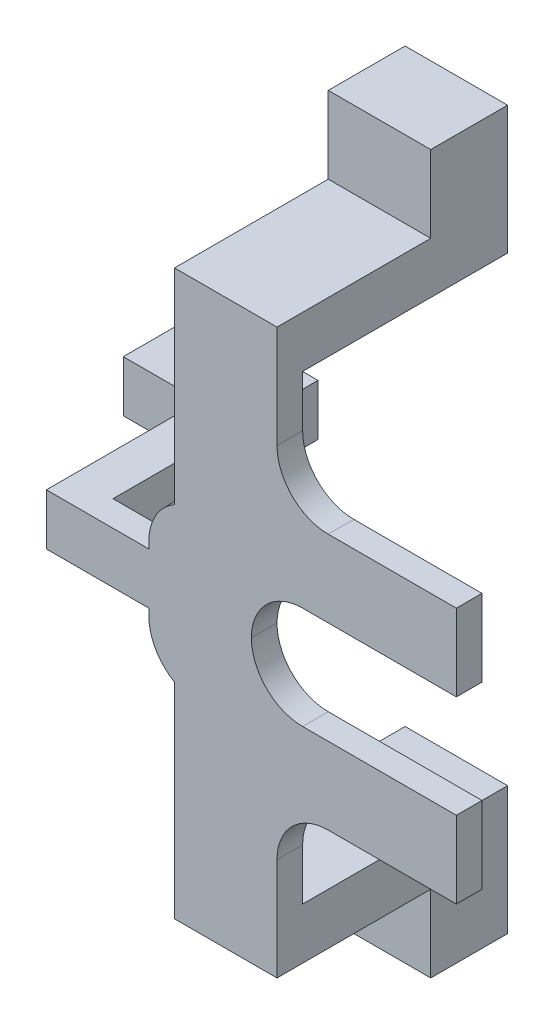
ISO-10303-21;
HEADER;
FILE_DESCRIPTION(('STEP AP214'),'2;1');
FILE_NAME('part.step','',(''),(''),'','','');
FILE_SCHEMA(('AUTOMOTIVE_DESIGN { 1 0 10303 214 1 1 1 1 }'));
ENDSEC;
DATA;
#1=APPLICATION_CONTEXT('core data for automotive mechanical design processes');
#2=APPLICATION_PROTOCOL_DEFINITION('international standard','automotive_design',2000,#1);
#3=PRODUCT_CONTEXT('',#1,'mechanical');
#4=PRODUCT('Part','Part','',(#3));
#5=PRODUCT_RELATED_PRODUCT_CATEGORY('part','',(#4));
#6=PRODUCT_DEFINITION_FORMATION('','',#4);
#7=PRODUCT_DEFINITION_CONTEXT('part definition',#1,'design');
#8=PRODUCT_DEFINITION('design','',#6,#7);
#9=PRODUCT_DEFINITION_SHAPE('','',#8);
#10=(LENGTH_UNIT() NAMED_UNIT(*) SI_UNIT(.MILLI.,.METRE.));
#11=(NAMED_UNIT(*) PLANE_ANGLE_UNIT() SI_UNIT($,.RADIAN.));
#12=(NAMED_UNIT(*) SI_UNIT($,.STERADIAN.) SOLID_ANGLE_UNIT());
#13=UNCERTAINTY_MEASURE_WITH_UNIT(LENGTH_MEASURE(1.E-05),#10,'distance_accuracy_value','');
#14=(GEOMETRIC_REPRESENTATION_CONTEXT(3) GLOBAL_UNCERTAINTY_ASSIGNED_CONTEXT((#13)) GLOBAL_UNIT_ASSIGNED_CONTEXT((#10,
#11,#12)) REPRESENTATION_CONTEXT('',''));
#15=CARTESIAN_POINT('',(0.,0.,0.));
#16=DIRECTION('',(0.,0.,1.));
#17=DIRECTION('',(1.,0.,0.));
#18=AXIS2_PLACEMENT_3D('',#15,#16,#17);
#19=CARTESIAN_POINT('',(-5.,-15.,5.));
#20=DIRECTION('',(1.,0.,0.));
#21=DIRECTION('',(0.,1.,0.));
#22=AXIS2_PLACEMENT_3D('',#19,#20,#21);
#23=PLANE('',#22);
#24=DIRECTION('',(0.,-1.,0.));
#25=VECTOR('',#24,1.);
#26=CARTESIAN_POINT('',(-5.,-15.,0.));
#27=LINE('',#26,#25);
#28=CARTESIAN_POINT('',(-5.,-35.,0.));
#29=VERTEX_POINT('',#28);
#30=CARTESIAN_POINT('',(-5.,-45.,0.));
#31=VERTEX_POINT('',#30);
#32=EDGE_CURVE('E459',#29,#31,#27,.T.);
#33=ORIENTED_EDGE('',*,*,#32,.F.);
#34=DIRECTION('',(0.,0.,1.));
#35=VECTOR('',#34,1.);
#36=CARTESIAN_POINT('',(-5.,-35.,5.));
#37=LINE('',#36,#35);
#38=CARTESIAN_POINT('',(-5.,-35.,5.));
#39=VERTEX_POINT('',#38);
#40=EDGE_CURVE('E510',#29,#39,#37,.T.);
#41=ORIENTED_EDGE('',*,*,#40,.T.);
#42=DIRECTION('',(0.,-1.,0.));
#43=VECTOR('',#42,1.);
#44=CARTESIAN_POINT('',(-5.,-15.,5.));
#45=LINE('',#44,#43);
#46=CARTESIAN_POINT('',(-5.,-55.,5.));
#47=VERTEX_POINT('',#46);
#48=EDGE_CURVE('E458',#39,#47,#45,.T.);
#49=ORIENTED_EDGE('',*,*,#48,.T.);
#50=DIRECTION('',(0.,0.,-1.));
#51=VECTOR('',#50,1.);
#52=CARTESIAN_POINT('',(-5.,-55.,5.));
#53=LINE('',#52,#51);
#54=CARTESIAN_POINT('',(-5.,-55.,-25.));
#55=VERTEX_POINT('',#54);
#56=EDGE_CURVE('E471',#47,#55,#53,.T.);
#57=ORIENTED_EDGE('',*,*,#56,.T.);
#58=DIRECTION('',(0.,-1.,0.));
#59=VECTOR('',#58,1.);
#60=CARTESIAN_POINT('',(-5.,-55.,-25.));
#61=LINE('',#60,#59);
#62=CARTESIAN_POINT('',(-5.,-70.,-25.));
#63=VERTEX_POINT('',#62);
#64=EDGE_CURVE('E348',#55,#63,#61,.T.);
#65=ORIENTED_EDGE('',*,*,#64,.T.);
#66=DIRECTION('',(0.,0.,-1.));
#67=VECTOR('',#66,1.);
#68=CARTESIAN_POINT('',(-5.,-70.,-25.));
#69=LINE('',#68,#67);
#70=CARTESIAN_POINT('',(-5.,-70.,-40.));
#71=VERTEX_POINT('',#70);
#72=EDGE_CURVE('E354',#63,#71,#69,.T.);
#73=ORIENTED_EDGE('',*,*,#72,.T.);
#74=DIRECTION('',(0.,-1.,0.));
#75=VECTOR('',#74,1.);
#76=CARTESIAN_POINT('',(-5.,-55.,-40.));
#77=LINE('',#76,#75);
#78=CARTESIAN_POINT('',(-5.,-45.,-40.));
#79=VERTEX_POINT('',#78);
#80=EDGE_CURVE('E404',#79,#71,#77,.T.);
#81=ORIENTED_EDGE('',*,*,#80,.F.);
#82=DIRECTION('',(0.,0.,1.));
#83=VECTOR('',#82,1.);
#84=CARTESIAN_POINT('',(-5.,-45.,-40.));
#85=LINE('',#84,#83);
#86=EDGE_CURVE('E406',#79,#31,#85,.T.);
#87=ORIENTED_EDGE('',*,*,#86,.T.);
#88=EDGE_LOOP('',(#33,#41,#49,#57,#65,#73,#81,#87));
#89=FACE_BOUND('',#88,.T.);
#90=ADVANCED_FACE('F36',(#89),#23,.T.);
#91=CARTESIAN_POINT('',(30.,0.,5.));
#92=DIRECTION('',(-1.,0.,0.));
#93=DIRECTION('',(0.,0.,1.));
#94=AXIS2_PLACEMENT_3D('',#91,#92,#93);
#95=PLANE('',#94);
#96=DIRECTION('',(0.,1.,0.));
#97=VECTOR('',#96,1.);
#98=CARTESIAN_POINT('',(30.,0.,5.));
#99=LINE('',#98,#97);
#100=CARTESIAN_POINT('',(30.,10.,5.));
#101=VERTEX_POINT('',#100);
#102=CARTESIAN_POINT('',(30.,25.,5.));
#103=VERTEX_POINT('',#102);
#104=EDGE_CURVE('E501',#101,#103,#99,.T.);
#105=ORIENTED_EDGE('',*,*,#104,.F.);
#106=DIRECTION('',(0.,0.,1.));
#107=VECTOR('',#106,1.);
#108=CARTESIAN_POINT('',(30.,10.,0.));
#109=LINE('',#108,#107);
#110=CARTESIAN_POINT('',(30.,10.,0.));
#111=VERTEX_POINT('',#110);
#112=EDGE_CURVE('E317',#111,#101,#109,.T.);
#113=ORIENTED_EDGE('',*,*,#112,.F.);
#114=DIRECTION('',(0.,1.,0.));
#115=VECTOR('',#114,1.);
#116=CARTESIAN_POINT('',(30.,0.,0.));
#117=LINE('',#116,#115);
#118=CARTESIAN_POINT('',(30.,25.,0.));
#119=VERTEX_POINT('',#118);
#120=EDGE_CURVE('E279',#111,#119,#117,.T.);
#121=ORIENTED_EDGE('',*,*,#120,.T.);
#122=DIRECTION('',(0.,0.,1.));
#123=VECTOR('',#122,1.);
#124=CARTESIAN_POINT('',(30.,25.,0.));
#125=LINE('',#124,#123);
#126=EDGE_CURVE('E302',#119,#103,#125,.T.);
#127=ORIENTED_EDGE('',*,*,#126,.T.);
#128=EDGE_LOOP('',(#105,#113,#121,#127));
#129=FACE_BOUND('',#128,.T.);
#130=ADVANCED_FACE('F592',(#129),#95,.F.);
#131=CARTESIAN_POINT('',(-50.,-5.,5.));
#132=DIRECTION('',(-1.,0.,0.));
#133=DIRECTION('',(0.,0.,1.));
#134=AXIS2_PLACEMENT_3D('',#131,#132,#133);
#135=PLANE('',#134);
#136=DIRECTION('',(0.,0.,-1.));
#137=VECTOR('',#136,1.);
#138=CARTESIAN_POINT('',(-50.,5.,5.));
#139=LINE('',#138,#137);
#140=CARTESIAN_POINT('',(-50.,5.,5.));
#141=VERTEX_POINT('',#140);
#142=CARTESIAN_POINT('',(-50.,5.,-25.));
#143=VERTEX_POINT('',#142);
#144=EDGE_CURVE('E447',#141,#143,#139,.T.);
#145=ORIENTED_EDGE('',*,*,#144,.T.);
#146=DIRECTION('',(0.,-1.,0.));
#147=VECTOR('',#146,1.);
#148=CARTESIAN_POINT('',(-50.,5.,-25.));
#149=LINE('',#148,#147);
#150=CARTESIAN_POINT('',(-50.,-5.,-25.));
#151=VERTEX_POINT('',#150);
#152=EDGE_CURVE('E324',#143,#151,#149,.T.);
#153=ORIENTED_EDGE('',*,*,#152,.T.);
#154=DIRECTION('',(0.,0.,-1.));
#155=VECTOR('',#154,1.);
#156=CARTESIAN_POINT('',(-50.,-5.,5.));
#157=LINE('',#156,#155);
#158=CARTESIAN_POINT('',(-50.,-5.,5.));
#159=VERTEX_POINT('',#158);
#160=EDGE_CURVE('E450',#159,#151,#157,.T.);
#161=ORIENTED_EDGE('',*,*,#160,.F.);
#162=DIRECTION('',(0.,1.,0.));
#163=VECTOR('',#162,1.);
#164=CARTESIAN_POINT('',(-50.,-5.,5.));
#165=LINE('',#164,#163);
#166=EDGE_CURVE('E434',#159,#141,#165,.T.);
#167=ORIENTED_EDGE('',*,*,#166,.T.);
#168=EDGE_LOOP('',(#145,#153,#161,#167));
#169=FACE_BOUND('',#168,.T.);
#170=ADVANCED_FACE('F597',(#169),#135,.T.);
#171=CARTESIAN_POINT('',(-5.,-55.,5.));
#172=DIRECTION('',(0.,-1.,0.));
#173=DIRECTION('',(0.,0.,-1.));
#174=AXIS2_PLACEMENT_3D('',#171,#172,#173);
#175=PLANE('',#174);
#176=DIRECTION('',(0.,0.,-1.));
#177=VECTOR('',#176,1.);
#178=CARTESIAN_POINT('',(-25.,-55.,5.));
#179=LINE('',#178,#177);
#180=CARTESIAN_POINT('',(-25.,-55.,5.));
#181=VERTEX_POINT('',#180);
#182=CARTESIAN_POINT('',(-25.,-55.,-25.));
#183=VERTEX_POINT('',#182);
#184=EDGE_CURVE('E467',#181,#183,#179,.T.);
#185=ORIENTED_EDGE('',*,*,#184,.T.);
#186=DIRECTION('',(1.,0.,0.));
#187=VECTOR('',#186,1.);
#188=CARTESIAN_POINT('',(-25.,-55.,-25.));
#189=LINE('',#188,#187);
#190=EDGE_CURVE('E345',#183,#55,#189,.T.);
#191=ORIENTED_EDGE('',*,*,#190,.T.);
#192=ORIENTED_EDGE('',*,*,#56,.F.);
#193=DIRECTION('',(-1.,0.,0.));
#194=VECTOR('',#193,1.);
#195=CARTESIAN_POINT('',(-5.,-55.,5.));
#196=LINE('',#195,#194);
#197=EDGE_CURVE('E461',#47,#181,#196,.T.);
#198=ORIENTED_EDGE('',*,*,#197,.T.);
#199=EDGE_LOOP('',(#185,#191,#192,#198));
#200=FACE_BOUND('',#199,.T.);
#201=ADVANCED_FACE('F569',(#200),#175,.T.);
#202=CARTESIAN_POINT('',(-5.,55.,5.));
#203=DIRECTION('',(0.,1.,0.));
#204=DIRECTION('',(0.,0.,1.));
#205=AXIS2_PLACEMENT_3D('',#202,#203,#204);
#206=PLANE('',#205);
#207=DIRECTION('',(0.,0.,-1.));
#208=VECTOR('',#207,1.);
#209=CARTESIAN_POINT('',(-5.,55.,5.));
#210=LINE('',#209,#208);
#211=CARTESIAN_POINT('',(-5.,55.,5.));
#212=VERTEX_POINT('',#211);
#213=CARTESIAN_POINT('',(-5.,55.,-25.));
#214=VERTEX_POINT('',#213);
#215=EDGE_CURVE('E490',#212,#214,#210,.T.);
#216=ORIENTED_EDGE('',*,*,#215,.T.);
#217=DIRECTION('',(-1.,0.,0.));
#218=VECTOR('',#217,1.);
#219=CARTESIAN_POINT('',(-25.,55.,-25.));
#220=LINE('',#219,#218);
#221=CARTESIAN_POINT('',(-25.,55.,-25.));
#222=VERTEX_POINT('',#221);
#223=EDGE_CURVE('E363',#214,#222,#220,.T.);
#224=ORIENTED_EDGE('',*,*,#223,.T.);
#225=DIRECTION('',(0.,0.,-1.));
#226=VECTOR('',#225,1.);
#227=CARTESIAN_POINT('',(-25.,55.,5.));
#228=LINE('',#227,#226);
#229=CARTESIAN_POINT('',(-25.,55.,5.));
#230=VERTEX_POINT('',#229);
#231=EDGE_CURVE('E494',#230,#222,#228,.T.);
#232=ORIENTED_EDGE('',*,*,#231,.F.);
#233=DIRECTION('',(1.,0.,0.));
#234=VECTOR('',#233,1.);
#235=CARTESIAN_POINT('',(-5.,55.,5.));
#236=LINE('',#235,#234);
#237=EDGE_CURVE('E479',#230,#212,#236,.T.);
#238=ORIENTED_EDGE('',*,*,#237,.T.);
#239=EDGE_LOOP('',(#216,#224,#232,#238));
#240=FACE_BOUND('',#239,.T.);
#241=ADVANCED_FACE('F611',(#240),#206,.T.);
#242=CARTESIAN_POINT('',(0.,0.,0.));
#243=DIRECTION('',(0.,0.,1.));
#244=DIRECTION('',(1.,0.,0.));
#245=AXIS2_PLACEMENT_3D('',#242,#243,#244);
#246=PLANE('',#245);
#247=DIRECTION('',(0.,1.,0.));
#248=VECTOR('',#247,1.);
#249=CARTESIAN_POINT('',(-25.,-55.,0.));
#250=LINE('',#249,#248);
#251=CARTESIAN_POINT('',(-25.,-45.,0.));
#252=VERTEX_POINT('',#251);
#253=CARTESIAN_POINT('',(-25.,-15.,0.));
#254=VERTEX_POINT('',#253);
#255=EDGE_CURVE('E446',#252,#254,#250,.T.);
#256=ORIENTED_EDGE('',*,*,#255,.T.);
#257=CARTESIAN_POINT('',(-20.,-6.33974596215562,0.));
#258=DIRECTION('',(0.,0.,1.));
#259=DIRECTION('',(1.,0.,0.));
#260=AXIS2_PLACEMENT_3D('',#257,#258,#259);
#261=CIRCLE('',#260,10.);
#262=CARTESIAN_POINT('',(-30.,-6.33974596215562,0.));
#263=VERTEX_POINT('',#262);
#264=EDGE_CURVE('E539',#254,#263,#261,.F.);
#265=ORIENTED_EDGE('',*,*,#264,.T.);
#266=DIRECTION('',(0.,1.,0.));
#267=VECTOR('',#266,1.);
#268=CARTESIAN_POINT('',(-30.,0.,0.));
#269=LINE('',#268,#267);
#270=CARTESIAN_POINT('',(-30.,-5.,0.));
#271=VERTEX_POINT('',#270);
#272=EDGE_CURVE('E504',#263,#271,#269,.T.);
#273=ORIENTED_EDGE('',*,*,#272,.T.);
#274=DIRECTION('',(-1.,0.,0.));
#275=VECTOR('',#274,1.);
#276=CARTESIAN_POINT('',(-50.,-5.,0.));
#277=LINE('',#276,#275);
#278=CARTESIAN_POINT('',(-42.,-5.,0.));
#279=VERTEX_POINT('',#278);
#280=EDGE_CURVE('E430',#271,#279,#277,.T.);
#281=ORIENTED_EDGE('',*,*,#280,.T.);
#282=DIRECTION('',(0.,-1.,0.));
#283=VECTOR('',#282,1.);
#284=CARTESIAN_POINT('',(-42.,-5.,0.));
#285=LINE('',#284,#283);
#286=CARTESIAN_POINT('',(-42.,5.,0.));
#287=VERTEX_POINT('',#286);
#288=EDGE_CURVE('E381',#287,#279,#285,.T.);
#289=ORIENTED_EDGE('',*,*,#288,.F.);
#290=DIRECTION('',(1.,0.,0.));
#291=VECTOR('',#290,1.);
#292=CARTESIAN_POINT('',(-50.,5.,0.));
#293=LINE('',#292,#291);
#294=CARTESIAN_POINT('',(-30.,5.,0.));
#295=VERTEX_POINT('',#294);
#296=EDGE_CURVE('E435',#287,#295,#293,.T.);
#297=ORIENTED_EDGE('',*,*,#296,.T.);
#298=CARTESIAN_POINT('',(-30.,6.33974596215561,0.));
#299=VERTEX_POINT('',#298);
#300=EDGE_CURVE('E493',#295,#299,#269,.T.);
#301=ORIENTED_EDGE('',*,*,#300,.T.);
#302=CARTESIAN_POINT('',(-20.,6.33974596215561,0.));
#303=DIRECTION('',(0.,0.,1.));
#304=DIRECTION('',(1.,0.,0.));
#305=AXIS2_PLACEMENT_3D('',#302,#303,#304);
#306=CIRCLE('',#305,10.);
#307=CARTESIAN_POINT('',(-25.,15.,0.));
#308=VERTEX_POINT('',#307);
#309=EDGE_CURVE('E535',#299,#308,#306,.F.);
#310=ORIENTED_EDGE('',*,*,#309,.T.);
#311=DIRECTION('',(0.,1.,0.));
#312=VECTOR('',#311,1.);
#313=CARTESIAN_POINT('',(-25.,55.,0.));
#314=LINE('',#313,#312);
#315=CARTESIAN_POINT('',(-25.,45.,0.));
#316=VERTEX_POINT('',#315);
#317=EDGE_CURVE('E470',#308,#316,#314,.T.);
#318=ORIENTED_EDGE('',*,*,#317,.T.);
#319=DIRECTION('',(-1.,0.,0.));
#320=VECTOR('',#319,1.);
#321=CARTESIAN_POINT('',(-5.,45.,0.));
#322=LINE('',#321,#320);
#323=CARTESIAN_POINT('',(-5.,45.,0.));
#324=VERTEX_POINT('',#323);
#325=EDGE_CURVE('E414',#324,#316,#322,.T.);
#326=ORIENTED_EDGE('',*,*,#325,.F.);
#327=DIRECTION('',(0.,-1.,0.));
#328=VECTOR('',#327,1.);
#329=CARTESIAN_POINT('',(-5.,15.,0.));
#330=LINE('',#329,#328);
#331=CARTESIAN_POINT('',(-5.,35.,0.));
#332=VERTEX_POINT('',#331);
#333=EDGE_CURVE('E480',#324,#332,#330,.T.);
#334=ORIENTED_EDGE('',*,*,#333,.T.);
#335=CARTESIAN_POINT('',(5.,35.,0.));
#336=DIRECTION('',(0.,0.,1.));
#337=DIRECTION('',(1.,0.,0.));
#338=AXIS2_PLACEMENT_3D('',#335,#336,#337);
#339=CIRCLE('',#338,10.);
#340=CARTESIAN_POINT('',(5.,25.,0.));
#341=VERTEX_POINT('',#340);
#342=EDGE_CURVE('E533',#332,#341,#339,.T.);
#343=ORIENTED_EDGE('',*,*,#342,.T.);
#344=DIRECTION('',(-1.,0.,0.));
#345=VECTOR('',#344,1.);
#346=CARTESIAN_POINT('',(0.,25.,0.));
#347=LINE('',#346,#345);
#348=EDGE_CURVE('E299',#119,#341,#347,.T.);
#349=ORIENTED_EDGE('',*,*,#348,.F.);
#350=ORIENTED_EDGE('',*,*,#120,.F.);
#351=DIRECTION('',(-1.,0.,0.));
#352=VECTOR('',#351,1.);
#353=CARTESIAN_POINT('',(-10.,10.,0.));
#354=LINE('',#353,#352);
#355=CARTESIAN_POINT('',(0.,10.,0.));
#356=VERTEX_POINT('',#355);
#357=EDGE_CURVE('E309',#111,#356,#354,.T.);
#358=ORIENTED_EDGE('',*,*,#357,.T.);
#359=CARTESIAN_POINT('',(0.,0.,0.));
#360=DIRECTION('',(0.,0.,1.));
#361=DIRECTION('',(1.,0.,0.));
#362=AXIS2_PLACEMENT_3D('',#359,#360,#361);
#363=CIRCLE('',#362,10.);
#364=CARTESIAN_POINT('',(-10.,0.,0.));
#365=VERTEX_POINT('',#364);
#366=EDGE_CURVE('E525',#356,#365,#363,.T.);
#367=ORIENTED_EDGE('',*,*,#366,.T.);
#368=CARTESIAN_POINT('',(0.,0.,0.));
#369=DIRECTION('',(0.,0.,1.));
#370=DIRECTION('',(1.,0.,0.));
#371=AXIS2_PLACEMENT_3D('',#368,#369,#370);
#372=CIRCLE('',#371,10.);
#373=CARTESIAN_POINT('',(0.,-10.,0.));
#374=VERTEX_POINT('',#373);
#375=EDGE_CURVE('E521',#365,#374,#372,.T.);
#376=ORIENTED_EDGE('',*,*,#375,.T.);
#377=DIRECTION('',(1.,0.,0.));
#378=VECTOR('',#377,1.);
#379=CARTESIAN_POINT('',(-10.,-10.,0.));
#380=LINE('',#379,#378);
#381=CARTESIAN_POINT('',(30.,-10.,0.));
#382=VERTEX_POINT('',#381);
#383=EDGE_CURVE('E274',#374,#382,#380,.T.);
#384=ORIENTED_EDGE('',*,*,#383,.T.);
#385=CARTESIAN_POINT('',(30.,-25.,0.));
#386=VERTEX_POINT('',#385);
#387=EDGE_CURVE('E266',#386,#382,#117,.T.);
#388=ORIENTED_EDGE('',*,*,#387,.F.);
#389=DIRECTION('',(-1.,0.,0.));
#390=VECTOR('',#389,1.);
#391=CARTESIAN_POINT('',(0.,-25.,0.));
#392=LINE('',#391,#390);
#393=CARTESIAN_POINT('',(5.,-25.,0.));
#394=VERTEX_POINT('',#393);
#395=EDGE_CURVE('E271',#386,#394,#392,.T.);
#396=ORIENTED_EDGE('',*,*,#395,.T.);
#397=CARTESIAN_POINT('',(5.,-35.,0.));
#398=DIRECTION('',(0.,0.,1.));
#399=DIRECTION('',(1.,0.,0.));
#400=AXIS2_PLACEMENT_3D('',#397,#398,#399);
#401=CIRCLE('',#400,10.);
#402=EDGE_CURVE('E529',#394,#29,#401,.T.);
#403=ORIENTED_EDGE('',*,*,#402,.T.);
#404=ORIENTED_EDGE('',*,*,#32,.T.);
#405=DIRECTION('',(1.,0.,0.));
#406=VECTOR('',#405,1.);
#407=CARTESIAN_POINT('',(-5.,-45.,0.));
#408=LINE('',#407,#406);
#409=EDGE_CURVE('E399',#252,#31,#408,.T.);
#410=ORIENTED_EDGE('',*,*,#409,.F.);
#411=EDGE_LOOP('',(#256,#265,#273,#281,#289,#297,#301,#310,#318,#326,#334,#343,#349,#350,#358,
#367,#376,#384,#388,#396,#403,#404,#410));
#412=FACE_BOUND('',#411,.T.);
#413=ADVANCED_FACE('F269',(#412),#246,.F.);
#414=CARTESIAN_POINT('',(-30.,0.,5.));
#415=DIRECTION('',(-1.,0.,0.));
#416=DIRECTION('',(0.,0.,1.));
#417=AXIS2_PLACEMENT_3D('',#414,#415,#416);
#418=PLANE('',#417);
#419=ORIENTED_EDGE('',*,*,#272,.F.);
#420=DIRECTION('',(0.,0.,1.));
#421=VECTOR('',#420,1.);
#422=CARTESIAN_POINT('',(-30.,-6.33974596215562,5.));
#423=LINE('',#422,#421);
#424=CARTESIAN_POINT('',(-30.,-6.33974596215562,5.));
#425=VERTEX_POINT('',#424);
#426=EDGE_CURVE('E59',#263,#425,#423,.T.);
#427=ORIENTED_EDGE('',*,*,#426,.T.);
#428=DIRECTION('',(0.,1.,0.));
#429=VECTOR('',#428,1.);
#430=CARTESIAN_POINT('',(-30.,0.,5.));
#431=LINE('',#430,#429);
#432=CARTESIAN_POINT('',(-30.,-5.,5.));
#433=VERTEX_POINT('',#432);
#434=EDGE_CURVE('E499',#425,#433,#431,.T.);
#435=ORIENTED_EDGE('',*,*,#434,.T.);
#436=DIRECTION('',(0.,0.,-1.));
#437=VECTOR('',#436,1.);
#438=CARTESIAN_POINT('',(-30.,-5.,5.));
#439=LINE('',#438,#437);
#440=EDGE_CURVE('E440',#433,#271,#439,.T.);
#441=ORIENTED_EDGE('',*,*,#440,.T.);
#442=EDGE_LOOP('',(#419,#427,#435,#441));
#443=FACE_BOUND('',#442,.T.);
#444=ADVANCED_FACE('F621',(#443),#418,.T.);
#445=CARTESIAN_POINT('',(-30.,5.,5.));
#446=VERTEX_POINT('',#445);
#447=CARTESIAN_POINT('',(-30.,6.33974596215561,5.));
#448=VERTEX_POINT('',#447);
#449=EDGE_CURVE('E278',#446,#448,#431,.T.);
#450=ORIENTED_EDGE('',*,*,#449,.T.);
#451=DIRECTION('',(0.,0.,1.));
#452=VECTOR('',#451,1.);
#453=CARTESIAN_POINT('',(-30.,6.33974596215561,0.));
#454=LINE('',#453,#452);
#455=EDGE_CURVE('E11',#448,#299,#454,.F.);
#456=ORIENTED_EDGE('',*,*,#455,.T.);
#457=ORIENTED_EDGE('',*,*,#300,.F.);
#458=DIRECTION('',(0.,0.,-1.));
#459=VECTOR('',#458,1.);
#460=CARTESIAN_POINT('',(-30.,5.,5.));
#461=LINE('',#460,#459);
#462=EDGE_CURVE('E443',#446,#295,#461,.T.);
#463=ORIENTED_EDGE('',*,*,#462,.F.);
#464=EDGE_LOOP('',(#450,#456,#457,#463));
#465=FACE_BOUND('',#464,.T.);
#466=ADVANCED_FACE('F624',(#465),#418,.T.);
#467=ORIENTED_EDGE('',*,*,#387,.T.);
#468=DIRECTION('',(0.,0.,1.));
#469=VECTOR('',#468,1.);
#470=CARTESIAN_POINT('',(30.,-10.,0.));
#471=LINE('',#470,#469);
#472=CARTESIAN_POINT('',(30.,-10.,5.));
#473=VERTEX_POINT('',#472);
#474=EDGE_CURVE('E313',#382,#473,#471,.T.);
#475=ORIENTED_EDGE('',*,*,#474,.T.);
#476=CARTESIAN_POINT('',(30.,-25.,5.));
#477=VERTEX_POINT('',#476);
#478=EDGE_CURVE('E285',#477,#473,#99,.T.);
#479=ORIENTED_EDGE('',*,*,#478,.F.);
#480=DIRECTION('',(0.,0.,1.));
#481=VECTOR('',#480,1.);
#482=CARTESIAN_POINT('',(30.,-25.,0.));
#483=LINE('',#482,#481);
#484=EDGE_CURVE('E282',#386,#477,#483,.T.);
#485=ORIENTED_EDGE('',*,*,#484,.F.);
#486=EDGE_LOOP('',(#467,#475,#479,#485));
#487=FACE_BOUND('',#486,.T.);
#488=ADVANCED_FACE('F283',(#487),#95,.F.);
#489=CARTESIAN_POINT('',(0.,0.,5.));
#490=DIRECTION('',(0.,0.,1.));
#491=DIRECTION('',(1.,0.,0.));
#492=AXIS2_PLACEMENT_3D('',#489,#490,#491);
#493=PLANE('',#492);
#494=ORIENTED_EDGE('',*,*,#434,.F.);
#495=CARTESIAN_POINT('',(-20.,-6.33974596215562,5.));
#496=DIRECTION('',(0.,0.,1.));
#497=DIRECTION('',(1.,0.,0.));
#498=AXIS2_PLACEMENT_3D('',#495,#496,#497);
#499=CIRCLE('',#498,10.);
#500=CARTESIAN_POINT('',(-25.,-15.,5.));
#501=VERTEX_POINT('',#500);
#502=EDGE_CURVE('E44',#425,#501,#499,.T.);
#503=ORIENTED_EDGE('',*,*,#502,.T.);
#504=DIRECTION('',(0.,1.,0.));
#505=VECTOR('',#504,1.);
#506=CARTESIAN_POINT('',(-25.,-55.,5.));
#507=LINE('',#506,#505);
#508=EDGE_CURVE('E455',#181,#501,#507,.T.);
#509=ORIENTED_EDGE('',*,*,#508,.F.);
#510=ORIENTED_EDGE('',*,*,#197,.F.);
#511=ORIENTED_EDGE('',*,*,#48,.F.);
#512=CARTESIAN_POINT('',(5.,-35.,5.));
#513=DIRECTION('',(0.,0.,1.));
#514=DIRECTION('',(1.,0.,0.));
#515=AXIS2_PLACEMENT_3D('',#512,#513,#514);
#516=CIRCLE('',#515,10.);
#517=CARTESIAN_POINT('',(5.,-25.,5.));
#518=VERTEX_POINT('',#517);
#519=EDGE_CURVE('E527',#39,#518,#516,.F.);
#520=ORIENTED_EDGE('',*,*,#519,.T.);
#521=DIRECTION('',(-1.,0.,0.));
#522=VECTOR('',#521,1.);
#523=CARTESIAN_POINT('',(0.,-25.,5.));
#524=LINE('',#523,#522);
#525=EDGE_CURVE('E294',#477,#518,#524,.T.);
#526=ORIENTED_EDGE('',*,*,#525,.F.);
#527=ORIENTED_EDGE('',*,*,#478,.T.);
#528=DIRECTION('',(1.,0.,0.));
#529=VECTOR('',#528,1.);
#530=CARTESIAN_POINT('',(-10.,-10.,5.));
#531=LINE('',#530,#529);
#532=CARTESIAN_POINT('',(0.,-10.,5.));
#533=VERTEX_POINT('',#532);
#534=EDGE_CURVE('E307',#533,#473,#531,.T.);
#535=ORIENTED_EDGE('',*,*,#534,.F.);
#536=CARTESIAN_POINT('',(0.,0.,5.));
#537=DIRECTION('',(0.,0.,1.));
#538=DIRECTION('',(1.,0.,0.));
#539=AXIS2_PLACEMENT_3D('',#536,#537,#538);
#540=CIRCLE('',#539,10.);
#541=CARTESIAN_POINT('',(-10.,0.,5.));
#542=VERTEX_POINT('',#541);
#543=EDGE_CURVE('E519',#533,#542,#540,.F.);
#544=ORIENTED_EDGE('',*,*,#543,.T.);
#545=CARTESIAN_POINT('',(0.,0.,5.));
#546=DIRECTION('',(0.,0.,1.));
#547=DIRECTION('',(1.,0.,0.));
#548=AXIS2_PLACEMENT_3D('',#545,#546,#547);
#549=CIRCLE('',#548,10.);
#550=CARTESIAN_POINT('',(0.,10.,5.));
#551=VERTEX_POINT('',#550);
#552=EDGE_CURVE('E523',#542,#551,#549,.F.);
#553=ORIENTED_EDGE('',*,*,#552,.T.);
#554=DIRECTION('',(-1.,0.,0.));
#555=VECTOR('',#554,1.);
#556=CARTESIAN_POINT('',(-10.,10.,5.));
#557=LINE('',#556,#555);
#558=EDGE_CURVE('E310',#101,#551,#557,.T.);
#559=ORIENTED_EDGE('',*,*,#558,.F.);
#560=ORIENTED_EDGE('',*,*,#104,.T.);
#561=DIRECTION('',(-1.,0.,0.));
#562=VECTOR('',#561,1.);
#563=CARTESIAN_POINT('',(0.,25.,5.));
#564=LINE('',#563,#562);
#565=CARTESIAN_POINT('',(5.,25.,5.));
#566=VERTEX_POINT('',#565);
#567=EDGE_CURVE('E289',#103,#566,#564,.T.);
#568=ORIENTED_EDGE('',*,*,#567,.T.);
#569=CARTESIAN_POINT('',(5.,35.,5.));
#570=DIRECTION('',(0.,0.,1.));
#571=DIRECTION('',(1.,0.,0.));
#572=AXIS2_PLACEMENT_3D('',#569,#570,#571);
#573=CIRCLE('',#572,10.);
#574=CARTESIAN_POINT('',(-5.,35.,5.));
#575=VERTEX_POINT('',#574);
#576=EDGE_CURVE('E531',#566,#575,#573,.F.);
#577=ORIENTED_EDGE('',*,*,#576,.T.);
#578=DIRECTION('',(0.,-1.,0.));
#579=VECTOR('',#578,1.);
#580=CARTESIAN_POINT('',(-5.,15.,5.));
#581=LINE('',#580,#579);
#582=EDGE_CURVE('E483',#212,#575,#581,.T.);
#583=ORIENTED_EDGE('',*,*,#582,.F.);
#584=ORIENTED_EDGE('',*,*,#237,.F.);
#585=DIRECTION('',(0.,1.,0.));
#586=VECTOR('',#585,1.);
#587=CARTESIAN_POINT('',(-25.,55.,5.));
#588=LINE('',#587,#586);
#589=CARTESIAN_POINT('',(-25.,15.,5.));
#590=VERTEX_POINT('',#589);
#591=EDGE_CURVE('E476',#590,#230,#588,.T.);
#592=ORIENTED_EDGE('',*,*,#591,.F.);
#593=CARTESIAN_POINT('',(-20.,6.33974596215561,5.));
#594=DIRECTION('',(0.,0.,1.));
#595=DIRECTION('',(1.,0.,0.));
#596=AXIS2_PLACEMENT_3D('',#593,#594,#595);
#597=CIRCLE('',#596,10.);
#598=EDGE_CURVE('E51',#590,#448,#597,.T.);
#599=ORIENTED_EDGE('',*,*,#598,.T.);
#600=ORIENTED_EDGE('',*,*,#449,.F.);
#601=DIRECTION('',(1.,0.,0.));
#602=VECTOR('',#601,1.);
#603=CARTESIAN_POINT('',(-50.,5.,5.));
#604=LINE('',#603,#602);
#605=EDGE_CURVE('E438',#141,#446,#604,.T.);
#606=ORIENTED_EDGE('',*,*,#605,.F.);
#607=ORIENTED_EDGE('',*,*,#166,.F.);
#608=DIRECTION('',(-1.,0.,0.));
#609=VECTOR('',#608,1.);
#610=CARTESIAN_POINT('',(-50.,-5.,5.));
#611=LINE('',#610,#609);
#612=EDGE_CURVE('E431',#433,#159,#611,.T.);
#613=ORIENTED_EDGE('',*,*,#612,.F.);
#614=EDGE_LOOP('',(#494,#503,#509,#510,#511,#520,#526,#527,#535,#544,#553,#559,#560,#568,#577,
#583,#584,#592,#599,#600,#606,#607,#613));
#615=FACE_BOUND('',#614,.T.);
#616=ADVANCED_FACE('F544',(#615),#493,.T.);
#617=CARTESIAN_POINT('',(-5.,15.,5.));
#618=DIRECTION('',(1.,0.,0.));
#619=DIRECTION('',(0.,1.,0.));
#620=AXIS2_PLACEMENT_3D('',#617,#618,#619);
#621=PLANE('',#620);
#622=ORIENTED_EDGE('',*,*,#582,.T.);
#623=DIRECTION('',(0.,0.,1.));
#624=VECTOR('',#623,1.);
#625=CARTESIAN_POINT('',(-5.,35.,0.));
#626=LINE('',#625,#624);
#627=EDGE_CURVE('E517',#575,#332,#626,.F.);
#628=ORIENTED_EDGE('',*,*,#627,.T.);
#629=ORIENTED_EDGE('',*,*,#333,.F.);
#630=DIRECTION('',(0.,0.,1.));
#631=VECTOR('',#630,1.);
#632=CARTESIAN_POINT('',(-5.,45.,-40.));
#633=LINE('',#632,#631);
#634=CARTESIAN_POINT('',(-5.,45.,-40.));
#635=VERTEX_POINT('',#634);
#636=EDGE_CURVE('E427',#635,#324,#633,.T.);
#637=ORIENTED_EDGE('',*,*,#636,.F.);
#638=DIRECTION('',(0.,-1.,0.));
#639=VECTOR('',#638,1.);
#640=CARTESIAN_POINT('',(-5.,55.,-40.));
#641=LINE('',#640,#639);
#642=CARTESIAN_POINT('',(-5.,70.,-40.));
#643=VERTEX_POINT('',#642);
#644=EDGE_CURVE('E415',#643,#635,#641,.T.);
#645=ORIENTED_EDGE('',*,*,#644,.F.);
#646=DIRECTION('',(0.,0.,-1.));
#647=VECTOR('',#646,1.);
#648=CARTESIAN_POINT('',(-5.,70.,-25.));
#649=LINE('',#648,#647);
#650=CARTESIAN_POINT('',(-5.,70.,-25.));
#651=VERTEX_POINT('',#650);
#652=EDGE_CURVE('E378',#651,#643,#649,.T.);
#653=ORIENTED_EDGE('',*,*,#652,.F.);
#654=DIRECTION('',(0.,-1.,0.));
#655=VECTOR('',#654,1.);
#656=CARTESIAN_POINT('',(-5.,55.,-25.));
#657=LINE('',#656,#655);
#658=EDGE_CURVE('E372',#651,#214,#657,.T.);
#659=ORIENTED_EDGE('',*,*,#658,.T.);
#660=ORIENTED_EDGE('',*,*,#215,.F.);
#661=EDGE_LOOP('',(#622,#628,#629,#637,#645,#653,#659,#660));
#662=FACE_BOUND('',#661,.T.);
#663=ADVANCED_FACE('F607',(#662),#621,.T.);
#664=CARTESIAN_POINT('',(-25.,55.,5.));
#665=DIRECTION('',(-1.,0.,0.));
#666=DIRECTION('',(0.,-1.,0.));
#667=AXIS2_PLACEMENT_3D('',#664,#665,#666);
#668=PLANE('',#667);
#669=ORIENTED_EDGE('',*,*,#317,.F.);
#670=DIRECTION('',(0.,0.,-1.));
#671=VECTOR('',#670,1.);
#672=CARTESIAN_POINT('',(-25.,15.,5.));
#673=LINE('',#672,#671);
#674=EDGE_CURVE('E486',#590,#308,#673,.T.);
#675=ORIENTED_EDGE('',*,*,#674,.F.);
#676=ORIENTED_EDGE('',*,*,#591,.T.);
#677=ORIENTED_EDGE('',*,*,#231,.T.);
#678=DIRECTION('',(0.,1.,0.));
#679=VECTOR('',#678,1.);
#680=CARTESIAN_POINT('',(-25.,70.,-25.));
#681=LINE('',#680,#679);
#682=CARTESIAN_POINT('',(-25.,70.,-25.));
#683=VERTEX_POINT('',#682);
#684=EDGE_CURVE('E366',#222,#683,#681,.T.);
#685=ORIENTED_EDGE('',*,*,#684,.T.);
#686=DIRECTION('',(0.,0.,-1.));
#687=VECTOR('',#686,1.);
#688=CARTESIAN_POINT('',(-25.,70.,-25.));
#689=LINE('',#688,#687);
#690=CARTESIAN_POINT('',(-25.,70.,-40.));
#691=VERTEX_POINT('',#690);
#692=EDGE_CURVE('E375',#683,#691,#689,.T.);
#693=ORIENTED_EDGE('',*,*,#692,.T.);
#694=DIRECTION('',(0.,1.,0.));
#695=VECTOR('',#694,1.);
#696=CARTESIAN_POINT('',(-25.,55.,-40.));
#697=LINE('',#696,#695);
#698=CARTESIAN_POINT('',(-25.,45.,-40.));
#699=VERTEX_POINT('',#698);
#700=EDGE_CURVE('E420',#699,#691,#697,.T.);
#701=ORIENTED_EDGE('',*,*,#700,.F.);
#702=DIRECTION('',(0.,0.,1.));
#703=VECTOR('',#702,1.);
#704=CARTESIAN_POINT('',(-25.,45.,-40.));
#705=LINE('',#704,#703);
#706=EDGE_CURVE('E422',#699,#316,#705,.T.);
#707=ORIENTED_EDGE('',*,*,#706,.T.);
#708=EDGE_LOOP('',(#669,#675,#676,#677,#685,#693,#701,#707));
#709=FACE_BOUND('',#708,.T.);
#710=ADVANCED_FACE('F606',(#709),#668,.T.);
#711=CARTESIAN_POINT('',(-25.,-55.,5.));
#712=DIRECTION('',(-1.,0.,0.));
#713=DIRECTION('',(0.,-1.,0.));
#714=AXIS2_PLACEMENT_3D('',#711,#712,#713);
#715=PLANE('',#714);
#716=ORIENTED_EDGE('',*,*,#255,.F.);
#717=DIRECTION('',(0.,0.,1.));
#718=VECTOR('',#717,1.);
#719=CARTESIAN_POINT('',(-25.,-45.,-40.));
#720=LINE('',#719,#718);
#721=CARTESIAN_POINT('',(-25.,-45.,-40.));
#722=VERTEX_POINT('',#721);
#723=EDGE_CURVE('E411',#722,#252,#720,.T.);
#724=ORIENTED_EDGE('',*,*,#723,.F.);
#725=DIRECTION('',(0.,1.,0.));
#726=VECTOR('',#725,1.);
#727=CARTESIAN_POINT('',(-25.,-55.,-40.));
#728=LINE('',#727,#726);
#729=CARTESIAN_POINT('',(-25.,-70.,-40.));
#730=VERTEX_POINT('',#729);
#731=EDGE_CURVE('E400',#730,#722,#728,.T.);
#732=ORIENTED_EDGE('',*,*,#731,.F.);
#733=DIRECTION('',(0.,0.,-1.));
#734=VECTOR('',#733,1.);
#735=CARTESIAN_POINT('',(-25.,-70.,-25.));
#736=LINE('',#735,#734);
#737=CARTESIAN_POINT('',(-25.,-70.,-25.));
#738=VERTEX_POINT('',#737);
#739=EDGE_CURVE('E357',#738,#730,#736,.T.);
#740=ORIENTED_EDGE('',*,*,#739,.F.);
#741=DIRECTION('',(0.,1.,0.));
#742=VECTOR('',#741,1.);
#743=CARTESIAN_POINT('',(-25.,-70.,-25.));
#744=LINE('',#743,#742);
#745=EDGE_CURVE('E342',#738,#183,#744,.T.);
#746=ORIENTED_EDGE('',*,*,#745,.T.);
#747=ORIENTED_EDGE('',*,*,#184,.F.);
#748=ORIENTED_EDGE('',*,*,#508,.T.);
#749=DIRECTION('',(0.,0.,-1.));
#750=VECTOR('',#749,1.);
#751=CARTESIAN_POINT('',(-25.,-15.,5.));
#752=LINE('',#751,#750);
#753=EDGE_CURVE('E464',#501,#254,#752,.T.);
#754=ORIENTED_EDGE('',*,*,#753,.T.);
#755=EDGE_LOOP('',(#716,#724,#732,#740,#746,#747,#748,#754));
#756=FACE_BOUND('',#755,.T.);
#757=ADVANCED_FACE('F551',(#756),#715,.T.);
#758=CARTESIAN_POINT('',(-50.,5.,5.));
#759=DIRECTION('',(0.,1.,0.));
#760=DIRECTION('',(0.,0.,1.));
#761=AXIS2_PLACEMENT_3D('',#758,#759,#760);
#762=PLANE('',#761);
#763=ORIENTED_EDGE('',*,*,#296,.F.);
#764=DIRECTION('',(0.,0.,1.));
#765=VECTOR('',#764,1.);
#766=CARTESIAN_POINT('',(-42.,5.,-40.));
#767=LINE('',#766,#765);
#768=CARTESIAN_POINT('',(-42.,5.,-40.));
#769=VERTEX_POINT('',#768);
#770=EDGE_CURVE('E396',#769,#287,#767,.T.);
#771=ORIENTED_EDGE('',*,*,#770,.F.);
#772=DIRECTION('',(1.,0.,0.));
#773=VECTOR('',#772,1.);
#774=CARTESIAN_POINT('',(-42.,5.,-40.));
#775=LINE('',#774,#773);
#776=CARTESIAN_POINT('',(-65.,5.,-40.));
#777=VERTEX_POINT('',#776);
#778=EDGE_CURVE('E384',#777,#769,#775,.T.);
#779=ORIENTED_EDGE('',*,*,#778,.F.);
#780=DIRECTION('',(0.,0.,-1.));
#781=VECTOR('',#780,1.);
#782=CARTESIAN_POINT('',(-65.,5.,-25.));
#783=LINE('',#782,#781);
#784=CARTESIAN_POINT('',(-65.,5.,-25.));
#785=VERTEX_POINT('',#784);
#786=EDGE_CURVE('E336',#785,#777,#783,.T.);
#787=ORIENTED_EDGE('',*,*,#786,.F.);
#788=DIRECTION('',(1.,0.,0.));
#789=VECTOR('',#788,1.);
#790=CARTESIAN_POINT('',(-65.,5.,-25.));
#791=LINE('',#790,#789);
#792=EDGE_CURVE('E321',#785,#143,#791,.T.);
#793=ORIENTED_EDGE('',*,*,#792,.T.);
#794=ORIENTED_EDGE('',*,*,#144,.F.);
#795=ORIENTED_EDGE('',*,*,#605,.T.);
#796=ORIENTED_EDGE('',*,*,#462,.T.);
#797=EDGE_LOOP('',(#763,#771,#779,#787,#793,#794,#795,#796));
#798=FACE_BOUND('',#797,.T.);
#799=ADVANCED_FACE('F605',(#798),#762,.T.);
#800=CARTESIAN_POINT('',(-50.,-5.,5.));
#801=DIRECTION('',(0.,-1.,0.));
#802=DIRECTION('',(0.,0.,-1.));
#803=AXIS2_PLACEMENT_3D('',#800,#801,#802);
#804=PLANE('',#803);
#805=ORIENTED_EDGE('',*,*,#280,.F.);
#806=ORIENTED_EDGE('',*,*,#440,.F.);
#807=ORIENTED_EDGE('',*,*,#612,.T.);
#808=ORIENTED_EDGE('',*,*,#160,.T.);
#809=DIRECTION('',(-1.,0.,0.));
#810=VECTOR('',#809,1.);
#811=CARTESIAN_POINT('',(-50.,-5.,-25.));
#812=LINE('',#811,#810);
#813=CARTESIAN_POINT('',(-65.,-5.,-25.));
#814=VERTEX_POINT('',#813);
#815=EDGE_CURVE('E327',#151,#814,#812,.T.);
#816=ORIENTED_EDGE('',*,*,#815,.T.);
#817=DIRECTION('',(0.,0.,-1.));
#818=VECTOR('',#817,1.);
#819=CARTESIAN_POINT('',(-65.,-5.,-25.));
#820=LINE('',#819,#818);
#821=CARTESIAN_POINT('',(-65.,-5.,-40.));
#822=VERTEX_POINT('',#821);
#823=EDGE_CURVE('E333',#814,#822,#820,.T.);
#824=ORIENTED_EDGE('',*,*,#823,.T.);
#825=DIRECTION('',(-1.,0.,0.));
#826=VECTOR('',#825,1.);
#827=CARTESIAN_POINT('',(-50.,-5.,-40.));
#828=LINE('',#827,#826);
#829=CARTESIAN_POINT('',(-42.,-5.,-40.));
#830=VERTEX_POINT('',#829);
#831=EDGE_CURVE('E389',#830,#822,#828,.T.);
#832=ORIENTED_EDGE('',*,*,#831,.F.);
#833=DIRECTION('',(0.,0.,1.));
#834=VECTOR('',#833,1.);
#835=CARTESIAN_POINT('',(-42.,-5.,-40.));
#836=LINE('',#835,#834);
#837=EDGE_CURVE('E391',#830,#279,#836,.T.);
#838=ORIENTED_EDGE('',*,*,#837,.T.);
#839=EDGE_LOOP('',(#805,#806,#807,#808,#816,#824,#832,#838));
#840=FACE_BOUND('',#839,.T.);
#841=ADVANCED_FACE('F675',(#840),#804,.T.);
#842=CARTESIAN_POINT('',(-5.,45.,-40.));
#843=DIRECTION('',(0.,1.,0.));
#844=DIRECTION('',(0.,0.,1.));
#845=AXIS2_PLACEMENT_3D('',#842,#843,#844);
#846=PLANE('',#845);
#847=ORIENTED_EDGE('',*,*,#325,.T.);
#848=ORIENTED_EDGE('',*,*,#706,.F.);
#849=DIRECTION('',(-1.,0.,0.));
#850=VECTOR('',#849,1.);
#851=CARTESIAN_POINT('',(-5.,45.,-40.));
#852=LINE('',#851,#850);
#853=EDGE_CURVE('E418',#635,#699,#852,.T.);
#854=ORIENTED_EDGE('',*,*,#853,.F.);
#855=ORIENTED_EDGE('',*,*,#636,.T.);
#856=EDGE_LOOP('',(#847,#848,#854,#855));
#857=FACE_BOUND('',#856,.T.);
#858=ADVANCED_FACE('F697',(#857),#846,.F.);
#859=CARTESIAN_POINT('',(0.,0.,-40.));
#860=DIRECTION('',(0.,0.,-1.));
#861=DIRECTION('',(-1.,0.,0.));
#862=AXIS2_PLACEMENT_3D('',#859,#860,#861);
#863=PLANE('',#862);
#864=ORIENTED_EDGE('',*,*,#644,.T.);
#865=ORIENTED_EDGE('',*,*,#853,.T.);
#866=ORIENTED_EDGE('',*,*,#700,.T.);
#867=DIRECTION('',(1.,0.,0.));
#868=VECTOR('',#867,1.);
#869=CARTESIAN_POINT('',(-5.,70.,-40.));
#870=LINE('',#869,#868);
#871=EDGE_CURVE('E360',#691,#643,#870,.T.);
#872=ORIENTED_EDGE('',*,*,#871,.T.);
#873=EDGE_LOOP('',(#864,#865,#866,#872));
#874=FACE_BOUND('',#873,.T.);
#875=ADVANCED_FACE('F702',(#874),#863,.T.);
#876=CARTESIAN_POINT('',(-5.,-45.,-40.));
#877=DIRECTION('',(0.,-1.,0.));
#878=DIRECTION('',(0.,0.,-1.));
#879=AXIS2_PLACEMENT_3D('',#876,#877,#878);
#880=PLANE('',#879);
#881=ORIENTED_EDGE('',*,*,#409,.T.);
#882=ORIENTED_EDGE('',*,*,#86,.F.);
#883=DIRECTION('',(1.,0.,0.));
#884=VECTOR('',#883,1.);
#885=CARTESIAN_POINT('',(-5.,-45.,-40.));
#886=LINE('',#885,#884);
#887=EDGE_CURVE('E402',#722,#79,#886,.T.);
#888=ORIENTED_EDGE('',*,*,#887,.F.);
#889=ORIENTED_EDGE('',*,*,#723,.T.);
#890=EDGE_LOOP('',(#881,#882,#888,#889));
#891=FACE_BOUND('',#890,.T.);
#892=ADVANCED_FACE('F556',(#891),#880,.F.);
#893=CARTESIAN_POINT('',(0.,0.,-40.));
#894=DIRECTION('',(0.,0.,-1.));
#895=DIRECTION('',(-1.,0.,0.));
#896=AXIS2_PLACEMENT_3D('',#893,#894,#895);
#897=PLANE('',#896);
#898=ORIENTED_EDGE('',*,*,#80,.T.);
#899=DIRECTION('',(-1.,0.,0.));
#900=VECTOR('',#899,1.);
#901=CARTESIAN_POINT('',(-5.,-70.,-40.));
#902=LINE('',#901,#900);
#903=EDGE_CURVE('E339',#71,#730,#902,.T.);
#904=ORIENTED_EDGE('',*,*,#903,.T.);
#905=ORIENTED_EDGE('',*,*,#731,.T.);
#906=ORIENTED_EDGE('',*,*,#887,.T.);
#907=EDGE_LOOP('',(#898,#904,#905,#906));
#908=FACE_BOUND('',#907,.T.);
#909=ADVANCED_FACE('F560',(#908),#897,.T.);
#910=CARTESIAN_POINT('',(-42.,-5.,-40.));
#911=DIRECTION('',(-1.,0.,0.));
#912=DIRECTION('',(0.,0.,1.));
#913=AXIS2_PLACEMENT_3D('',#910,#911,#912);
#914=PLANE('',#913);
#915=ORIENTED_EDGE('',*,*,#288,.T.);
#916=ORIENTED_EDGE('',*,*,#837,.F.);
#917=DIRECTION('',(0.,-1.,0.));
#918=VECTOR('',#917,1.);
#919=CARTESIAN_POINT('',(-42.,-5.,-40.));
#920=LINE('',#919,#918);
#921=EDGE_CURVE('E387',#769,#830,#920,.T.);
#922=ORIENTED_EDGE('',*,*,#921,.F.);
#923=ORIENTED_EDGE('',*,*,#770,.T.);
#924=EDGE_LOOP('',(#915,#916,#922,#923));
#925=FACE_BOUND('',#924,.T.);
#926=ADVANCED_FACE('F678',(#925),#914,.F.);
#927=CARTESIAN_POINT('',(0.,0.,-40.));
#928=DIRECTION('',(0.,0.,1.));
#929=DIRECTION('',(1.,0.,0.));
#930=AXIS2_PLACEMENT_3D('',#927,#928,#929);
#931=PLANE('',#930);
#932=ORIENTED_EDGE('',*,*,#778,.T.);
#933=ORIENTED_EDGE('',*,*,#921,.T.);
#934=ORIENTED_EDGE('',*,*,#831,.T.);
#935=DIRECTION('',(0.,1.,0.));
#936=VECTOR('',#935,1.);
#937=CARTESIAN_POINT('',(-65.,-5.,-40.));
#938=LINE('',#937,#936);
#939=EDGE_CURVE('E319',#822,#777,#938,.T.);
#940=ORIENTED_EDGE('',*,*,#939,.T.);
#941=EDGE_LOOP('',(#932,#933,#934,#940));
#942=FACE_BOUND('',#941,.T.);
#943=ADVANCED_FACE('F682',(#942),#931,.F.);
#944=CARTESIAN_POINT('',(-5.,70.,-25.));
#945=DIRECTION('',(0.,1.,0.));
#946=DIRECTION('',(0.,0.,1.));
#947=AXIS2_PLACEMENT_3D('',#944,#945,#946);
#948=PLANE('',#947);
#949=ORIENTED_EDGE('',*,*,#871,.F.);
#950=ORIENTED_EDGE('',*,*,#692,.F.);
#951=DIRECTION('',(1.,0.,0.));
#952=VECTOR('',#951,1.);
#953=CARTESIAN_POINT('',(-5.,70.,-25.));
#954=LINE('',#953,#952);
#955=EDGE_CURVE('E369',#683,#651,#954,.T.);
#956=ORIENTED_EDGE('',*,*,#955,.T.);
#957=ORIENTED_EDGE('',*,*,#652,.T.);
#958=EDGE_LOOP('',(#949,#950,#956,#957));
#959=FACE_BOUND('',#958,.T.);
#960=ADVANCED_FACE('F811',(#959),#948,.T.);
#961=CARTESIAN_POINT('',(0.,0.,-25.));
#962=DIRECTION('',(0.,0.,1.));
#963=DIRECTION('',(1.,0.,0.));
#964=AXIS2_PLACEMENT_3D('',#961,#962,#963);
#965=PLANE('',#964);
#966=ORIENTED_EDGE('',*,*,#223,.F.);
#967=ORIENTED_EDGE('',*,*,#658,.F.);
#968=ORIENTED_EDGE('',*,*,#955,.F.);
#969=ORIENTED_EDGE('',*,*,#684,.F.);
#970=EDGE_LOOP('',(#966,#967,#968,#969));
#971=FACE_BOUND('',#970,.T.);
#972=ADVANCED_FACE('F820',(#971),#965,.T.);
#973=CARTESIAN_POINT('',(-5.,-70.,-25.));
#974=DIRECTION('',(0.,-1.,0.));
#975=DIRECTION('',(0.,0.,-1.));
#976=AXIS2_PLACEMENT_3D('',#973,#974,#975);
#977=PLANE('',#976);
#978=ORIENTED_EDGE('',*,*,#903,.F.);
#979=ORIENTED_EDGE('',*,*,#72,.F.);
#980=DIRECTION('',(-1.,0.,0.));
#981=VECTOR('',#980,1.);
#982=CARTESIAN_POINT('',(-5.,-70.,-25.));
#983=LINE('',#982,#981);
#984=EDGE_CURVE('E351',#63,#738,#983,.T.);
#985=ORIENTED_EDGE('',*,*,#984,.T.);
#986=ORIENTED_EDGE('',*,*,#739,.T.);
#987=EDGE_LOOP('',(#978,#979,#985,#986));
#988=FACE_BOUND('',#987,.T.);
#989=ADVANCED_FACE('F564',(#988),#977,.T.);
#990=CARTESIAN_POINT('',(0.,0.,-25.));
#991=DIRECTION('',(0.,0.,-1.));
#992=DIRECTION('',(-1.,0.,0.));
#993=AXIS2_PLACEMENT_3D('',#990,#991,#992);
#994=PLANE('',#993);
#995=ORIENTED_EDGE('',*,*,#745,.F.);
#996=ORIENTED_EDGE('',*,*,#984,.F.);
#997=ORIENTED_EDGE('',*,*,#64,.F.);
#998=ORIENTED_EDGE('',*,*,#190,.F.);
#999=EDGE_LOOP('',(#995,#996,#997,#998));
#1000=FACE_BOUND('',#999,.T.);
#1001=ADVANCED_FACE('F567',(#1000),#994,.F.);
#1002=CARTESIAN_POINT('',(-65.,-5.,-25.));
#1003=DIRECTION('',(-1.,0.,0.));
#1004=DIRECTION('',(0.,0.,1.));
#1005=AXIS2_PLACEMENT_3D('',#1002,#1003,#1004);
#1006=PLANE('',#1005);
#1007=ORIENTED_EDGE('',*,*,#939,.F.);
#1008=ORIENTED_EDGE('',*,*,#823,.F.);
#1009=DIRECTION('',(0.,1.,0.));
#1010=VECTOR('',#1009,1.);
#1011=CARTESIAN_POINT('',(-65.,-5.,-25.));
#1012=LINE('',#1011,#1010);
#1013=EDGE_CURVE('E330',#814,#785,#1012,.T.);
#1014=ORIENTED_EDGE('',*,*,#1013,.T.);
#1015=ORIENTED_EDGE('',*,*,#786,.T.);
#1016=EDGE_LOOP('',(#1007,#1008,#1014,#1015));
#1017=FACE_BOUND('',#1016,.T.);
#1018=ADVANCED_FACE('F685',(#1017),#1006,.T.);
#1019=CARTESIAN_POINT('',(0.,0.,-25.));
#1020=DIRECTION('',(0.,0.,-1.));
#1021=DIRECTION('',(-1.,0.,0.));
#1022=AXIS2_PLACEMENT_3D('',#1019,#1020,#1021);
#1023=PLANE('',#1022);
#1024=ORIENTED_EDGE('',*,*,#792,.F.);
#1025=ORIENTED_EDGE('',*,*,#1013,.F.);
#1026=ORIENTED_EDGE('',*,*,#815,.F.);
#1027=ORIENTED_EDGE('',*,*,#152,.F.);
#1028=EDGE_LOOP('',(#1024,#1025,#1026,#1027));
#1029=FACE_BOUND('',#1028,.T.);
#1030=ADVANCED_FACE('F688',(#1029),#1023,.F.);
#1031=CARTESIAN_POINT('',(-10.,10.,0.));
#1032=DIRECTION('',(0.,1.,0.));
#1033=DIRECTION('',(-1.,0.,0.));
#1034=AXIS2_PLACEMENT_3D('',#1031,#1032,#1033);
#1035=PLANE('',#1034);
#1036=ORIENTED_EDGE('',*,*,#558,.T.);
#1037=DIRECTION('',(0.,0.,1.));
#1038=VECTOR('',#1037,1.);
#1039=CARTESIAN_POINT('',(0.,10.,0.));
#1040=LINE('',#1039,#1038);
#1041=EDGE_CURVE('E508',#551,#356,#1040,.F.);
#1042=ORIENTED_EDGE('',*,*,#1041,.T.);
#1043=ORIENTED_EDGE('',*,*,#357,.F.);
#1044=ORIENTED_EDGE('',*,*,#112,.T.);
#1045=EDGE_LOOP('',(#1036,#1042,#1043,#1044));
#1046=FACE_BOUND('',#1045,.T.);
#1047=ADVANCED_FACE('F646',(#1046),#1035,.F.);
#1048=CARTESIAN_POINT('',(-10.,-10.,0.));
#1049=DIRECTION('',(0.,-1.,0.));
#1050=DIRECTION('',(0.,0.,-1.));
#1051=AXIS2_PLACEMENT_3D('',#1048,#1049,#1050);
#1052=PLANE('',#1051);
#1053=ORIENTED_EDGE('',*,*,#383,.F.);
#1054=DIRECTION('',(0.,0.,1.));
#1055=VECTOR('',#1054,1.);
#1056=CARTESIAN_POINT('',(0.,-10.,5.));
#1057=LINE('',#1056,#1055);
#1058=EDGE_CURVE('E503',#374,#533,#1057,.T.);
#1059=ORIENTED_EDGE('',*,*,#1058,.T.);
#1060=ORIENTED_EDGE('',*,*,#534,.T.);
#1061=ORIENTED_EDGE('',*,*,#474,.F.);
#1062=EDGE_LOOP('',(#1053,#1059,#1060,#1061));
#1063=FACE_BOUND('',#1062,.T.);
#1064=ADVANCED_FACE('F641',(#1063),#1052,.F.);
#1065=CARTESIAN_POINT('',(0.,25.,0.));
#1066=DIRECTION('',(0.,1.,0.));
#1067=DIRECTION('',(-1.,0.,0.));
#1068=AXIS2_PLACEMENT_3D('',#1065,#1066,#1067);
#1069=PLANE('',#1068);
#1070=ORIENTED_EDGE('',*,*,#348,.T.);
#1071=DIRECTION('',(0.,0.,1.));
#1072=VECTOR('',#1071,1.);
#1073=CARTESIAN_POINT('',(5.,25.,5.));
#1074=LINE('',#1073,#1072);
#1075=EDGE_CURVE('E514',#341,#566,#1074,.T.);
#1076=ORIENTED_EDGE('',*,*,#1075,.T.);
#1077=ORIENTED_EDGE('',*,*,#567,.F.);
#1078=ORIENTED_EDGE('',*,*,#126,.F.);
#1079=EDGE_LOOP('',(#1070,#1076,#1077,#1078));
#1080=FACE_BOUND('',#1079,.T.);
#1081=ADVANCED_FACE('F632',(#1080),#1069,.T.);
#1082=CARTESIAN_POINT('',(0.,-25.,0.));
#1083=DIRECTION('',(0.,1.,0.));
#1084=DIRECTION('',(-1.,0.,0.));
#1085=AXIS2_PLACEMENT_3D('',#1082,#1083,#1084);
#1086=PLANE('',#1085);
#1087=ORIENTED_EDGE('',*,*,#525,.T.);
#1088=DIRECTION('',(0.,0.,1.));
#1089=VECTOR('',#1088,1.);
#1090=CARTESIAN_POINT('',(5.,-25.,0.));
#1091=LINE('',#1090,#1089);
#1092=EDGE_CURVE('E293',#518,#394,#1091,.F.);
#1093=ORIENTED_EDGE('',*,*,#1092,.T.);
#1094=ORIENTED_EDGE('',*,*,#395,.F.);
#1095=ORIENTED_EDGE('',*,*,#484,.T.);
#1096=EDGE_LOOP('',(#1087,#1093,#1094,#1095));
#1097=FACE_BOUND('',#1096,.T.);
#1098=ADVANCED_FACE('F291',(#1097),#1086,.F.);
#1099=CARTESIAN_POINT('',(0.,0.,0.));
#1100=DIRECTION('',(0.,0.,-1.));
#1101=DIRECTION('',(-1.,0.,0.));
#1102=AXIS2_PLACEMENT_3D('',#1099,#1100,#1101);
#1103=CYLINDRICAL_SURFACE('',#1102,10.);
#1104=DIRECTION('',(0.,0.,1.));
#1105=VECTOR('',#1104,1.);
#1106=CARTESIAN_POINT('',(-10.,0.,5.));
#1107=LINE('',#1106,#1105);
#1108=EDGE_CURVE('E296',#365,#542,#1107,.T.);
#1109=ORIENTED_EDGE('',*,*,#1108,.F.);
#1110=ORIENTED_EDGE('',*,*,#366,.F.);
#1111=ORIENTED_EDGE('',*,*,#1041,.F.);
#1112=ORIENTED_EDGE('',*,*,#552,.F.);
#1113=EDGE_LOOP('',(#1109,#1110,#1111,#1112));
#1114=FACE_BOUND('',#1113,.T.);
#1115=ADVANCED_FACE('F587',(#1114),#1103,.F.);
#1116=CARTESIAN_POINT('',(0.,0.,0.));
#1117=DIRECTION('',(0.,0.,-1.));
#1118=DIRECTION('',(-1.,0.,0.));
#1119=AXIS2_PLACEMENT_3D('',#1116,#1117,#1118);
#1120=CYLINDRICAL_SURFACE('',#1119,10.);
#1121=ORIENTED_EDGE('',*,*,#375,.F.);
#1122=ORIENTED_EDGE('',*,*,#1108,.T.);
#1123=ORIENTED_EDGE('',*,*,#543,.F.);
#1124=ORIENTED_EDGE('',*,*,#1058,.F.);
#1125=EDGE_LOOP('',(#1121,#1122,#1123,#1124));
#1126=FACE_BOUND('',#1125,.T.);
#1127=ADVANCED_FACE('F579',(#1126),#1120,.F.);
#1128=CARTESIAN_POINT('',(5.,-35.,5.));
#1129=DIRECTION('',(0.,0.,1.));
#1130=DIRECTION('',(1.,0.,0.));
#1131=AXIS2_PLACEMENT_3D('',#1128,#1129,#1130);
#1132=CYLINDRICAL_SURFACE('',#1131,10.);
#1133=ORIENTED_EDGE('',*,*,#402,.F.);
#1134=ORIENTED_EDGE('',*,*,#1092,.F.);
#1135=ORIENTED_EDGE('',*,*,#519,.F.);
#1136=ORIENTED_EDGE('',*,*,#40,.F.);
#1137=EDGE_LOOP('',(#1133,#1134,#1135,#1136));
#1138=FACE_BOUND('',#1137,.T.);
#1139=ADVANCED_FACE('F576',(#1138),#1132,.F.);
#1140=CARTESIAN_POINT('',(5.,35.,0.));
#1141=DIRECTION('',(0.,0.,-1.));
#1142=DIRECTION('',(-1.,0.,0.));
#1143=AXIS2_PLACEMENT_3D('',#1140,#1141,#1142);
#1144=CYLINDRICAL_SURFACE('',#1143,10.);
#1145=ORIENTED_EDGE('',*,*,#342,.F.);
#1146=ORIENTED_EDGE('',*,*,#627,.F.);
#1147=ORIENTED_EDGE('',*,*,#576,.F.);
#1148=ORIENTED_EDGE('',*,*,#1075,.F.);
#1149=EDGE_LOOP('',(#1145,#1146,#1147,#1148));
#1150=FACE_BOUND('',#1149,.T.);
#1151=ADVANCED_FACE('F578',(#1150),#1144,.F.);
#1152=CARTESIAN_POINT('',(-20.,-6.33974596215562,5.));
#1153=DIRECTION('',(0.,0.,-1.));
#1154=DIRECTION('',(-1.,0.,0.));
#1155=AXIS2_PLACEMENT_3D('',#1152,#1153,#1154);
#1156=CYLINDRICAL_SURFACE('',#1155,10.);
#1157=ORIENTED_EDGE('',*,*,#502,.F.);
#1158=ORIENTED_EDGE('',*,*,#426,.F.);
#1159=ORIENTED_EDGE('',*,*,#264,.F.);
#1160=ORIENTED_EDGE('',*,*,#753,.F.);
#1161=EDGE_LOOP('',(#1157,#1158,#1159,#1160));
#1162=FACE_BOUND('',#1161,.T.);
#1163=ADVANCED_FACE('F552',(#1162),#1156,.T.);
#1164=CARTESIAN_POINT('',(-20.,6.33974596215561,5.));
#1165=DIRECTION('',(0.,0.,-1.));
#1166=DIRECTION('',(-1.,0.,0.));
#1167=AXIS2_PLACEMENT_3D('',#1164,#1165,#1166);
#1168=CYLINDRICAL_SURFACE('',#1167,10.);
#1169=ORIENTED_EDGE('',*,*,#598,.F.);
#1170=ORIENTED_EDGE('',*,*,#674,.T.);
#1171=ORIENTED_EDGE('',*,*,#309,.F.);
#1172=ORIENTED_EDGE('',*,*,#455,.F.);
#1173=EDGE_LOOP('',(#1169,#1170,#1171,#1172));
#1174=FACE_BOUND('',#1173,.T.);
#1175=ADVANCED_FACE('F38',(#1174),#1168,.T.);
#1176=CLOSED_SHELL('',(#90,#130,#170,#201,#241,#413,#444,#466,#488,#616,#663,#710,#757,#799,
#841,#858,#875,#892,#909,#926,#943,#960,#972,#989,#1001,#1018,#1030,#1047,#1064,#1081,#1098,
#1115,#1127,#1139,#1151,#1163,#1175));
#1177=MANIFOLD_SOLID_BREP('B2',#1176);
#1178=ADVANCED_BREP_SHAPE_REPRESENTATION('',(#18,#1177),#14);
#1179=SHAPE_DEFINITION_REPRESENTATION(#9,#1178);
ENDSEC;
END-ISO-10303-21;
